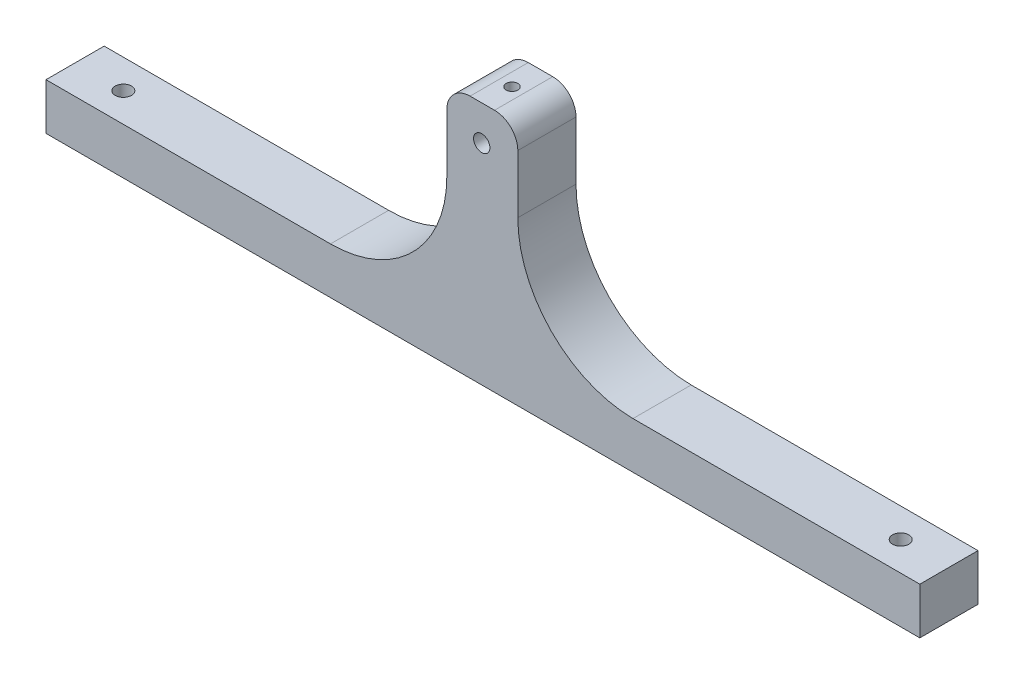
ISO-10303-21;
HEADER;
FILE_DESCRIPTION(('STEP AP214'),'2;1');
FILE_NAME('part.step','',(''),(''),'','','');
FILE_SCHEMA(('AUTOMOTIVE_DESIGN { 1 0 10303 214 1 1 1 1 }'));
ENDSEC;
DATA;
#1=APPLICATION_CONTEXT('core data for automotive mechanical design processes');
#2=APPLICATION_PROTOCOL_DEFINITION('international standard','automotive_design',2000,#1);
#3=PRODUCT_CONTEXT('',#1,'mechanical');
#4=PRODUCT('Part','Part','',(#3));
#5=PRODUCT_RELATED_PRODUCT_CATEGORY('part','',(#4));
#6=PRODUCT_DEFINITION_FORMATION('','',#4);
#7=PRODUCT_DEFINITION_CONTEXT('part definition',#1,'design');
#8=PRODUCT_DEFINITION('design','',#6,#7);
#9=PRODUCT_DEFINITION_SHAPE('','',#8);
#10=(LENGTH_UNIT() NAMED_UNIT(*) SI_UNIT(.MILLI.,.METRE.));
#11=(NAMED_UNIT(*) PLANE_ANGLE_UNIT() SI_UNIT($,.RADIAN.));
#12=(NAMED_UNIT(*) SI_UNIT($,.STERADIAN.) SOLID_ANGLE_UNIT());
#13=UNCERTAINTY_MEASURE_WITH_UNIT(LENGTH_MEASURE(1.E-05),#10,'distance_accuracy_value','');
#14=(GEOMETRIC_REPRESENTATION_CONTEXT(3) GLOBAL_UNCERTAINTY_ASSIGNED_CONTEXT((#13)) GLOBAL_UNIT_ASSIGNED_CONTEXT((#10,
#11,#12)) REPRESENTATION_CONTEXT('',''));
#15=CARTESIAN_POINT('',(0.,0.,0.));
#16=DIRECTION('',(0.,0.,1.));
#17=DIRECTION('',(1.,0.,0.));
#18=AXIS2_PLACEMENT_3D('',#15,#16,#17);
#19=CARTESIAN_POINT('',(0.,4.,0.));
#20=DIRECTION('',(0.,-1.,0.));
#21=DIRECTION('',(0.,0.,-1.));
#22=AXIS2_PLACEMENT_3D('',#19,#20,#21);
#23=CYLINDRICAL_SURFACE('',#22,0.500000000000001);
#24=CARTESIAN_POINT('',(0.,18.695534913197,-0.500000000000001));
#25=CARTESIAN_POINT('',(-0.0237053637619565,18.699008131052,-0.499997494786262));
#26=CARTESIAN_POINT('',(-0.0476111146058155,18.7012660395519,-0.498302834068711));
#27=CARTESIAN_POINT('',(-0.0950644670900677,18.7033398421985,-0.491466676561693));
#28=CARTESIAN_POINT('',(-0.118611338856112,18.7031512906899,-0.486318920976379));
#29=CARTESIAN_POINT('',(-0.1645179646005,18.7005595831414,-0.472762829505504));
#30=CARTESIAN_POINT('',(-0.186881650820679,18.6981643233225,-0.464366181166829));
#31=CARTESIAN_POINT('',(-0.229956831156418,18.6915670708588,-0.44461439062729));
#32=CARTESIAN_POINT('',(-0.250668377227918,18.6873651350564,-0.433259341509148));
#33=CARTESIAN_POINT('',(-0.291077151550338,18.6773953998593,-0.407284075831416));
#34=CARTESIAN_POINT('',(-0.310668649692109,18.6715586236971,-0.39252678322211));
#35=CARTESIAN_POINT('',(-0.347353949116722,18.6590409547665,-0.360471397952351));
#36=CARTESIAN_POINT('',(-0.364445543738273,18.6523593258305,-0.343171087255299));
#37=CARTESIAN_POINT('',(-0.398297140588118,18.6377707032949,-0.303541393532862));
#38=CARTESIAN_POINT('',(-0.414617667843519,18.6298309840516,-0.280847074303816));
#39=CARTESIAN_POINT('',(-0.44334718044683,18.6147346653243,-0.232861325212085));
#40=CARTESIAN_POINT('',(-0.455757434768082,18.6075778122755,-0.207570741436566));
#41=CARTESIAN_POINT('',(-0.474764685533687,18.5960731262698,-0.158688314646173));
#42=CARTESIAN_POINT('',(-0.481945072781722,18.591467997653,-0.135385459309714));
#43=CARTESIAN_POINT('',(-0.492855517396195,18.5843166605364,-0.0876925840878041));
#44=CARTESIAN_POINT('',(-0.496590270570728,18.5817676504972,-0.0633040914281747));
#45=CARTESIAN_POINT('',(-0.500416719502144,18.5791548368849,-0.0140074038601794));
#46=CARTESIAN_POINT('',(-0.500494322941518,18.5791006467716,0.0109024314145192));
#47=CARTESIAN_POINT('',(-0.496964681671987,18.5815129278841,0.0603403554634231));
#48=CARTESIAN_POINT('',(-0.493355553969467,18.583980687193,0.084868242658923));
#49=CARTESIAN_POINT('',(-0.482945040410514,18.5908192985786,0.13155429442335));
#50=CARTESIAN_POINT('',(-0.476321955752921,18.5950829763731,0.153769219564148));
#51=CARTESIAN_POINT('',(-0.460207733552016,18.6049198681586,0.196819059655587));
#52=CARTESIAN_POINT('',(-0.45071545679698,18.6104936021111,0.217653422440926));
#53=CARTESIAN_POINT('',(-0.42751975561694,18.6232088763974,0.260586926005686));
#54=CARTESIAN_POINT('',(-0.413405256844381,18.6304605597961,0.282431308815597));
#55=CARTESIAN_POINT('',(-0.381975508989099,18.6450346881266,0.323678778980057));
#56=CARTESIAN_POINT('',(-0.364657290648408,18.6523571926807,0.34307957330892));
#57=CARTESIAN_POINT('',(-0.324775144776438,18.6671086211179,0.38127716868475));
#58=CARTESIAN_POINT('',(-0.301830085654281,18.6744432810943,0.399717056312423));
#59=CARTESIAN_POINT('',(-0.252663639625408,18.6870982244878,0.432470850704563));
#60=CARTESIAN_POINT('',(-0.226445220194764,18.6924203150206,0.446788456156758));
#61=CARTESIAN_POINT('',(-0.173895535103574,18.6997403479091,0.469581669374129));
#62=CARTESIAN_POINT('',(-0.147775060756627,18.701988498834,0.478458962239705));
#63=CARTESIAN_POINT('',(-0.0943547875079653,18.7034350987376,0.491784894562203));
#64=CARTESIAN_POINT('',(-0.0670563951955149,18.7026370907547,0.4962386714875));
#65=CARTESIAN_POINT('',(-0.0162589601854523,18.6981245696386,0.500291767865877));
#66=CARTESIAN_POINT('',(0.0072337418863273,18.6948366080972,0.500486400627405));
#67=CARTESIAN_POINT('',(0.0535748391224648,18.6859505500852,0.497663045365655));
#68=CARTESIAN_POINT('',(0.0764231998616531,18.6803523304335,0.494644886025338));
#69=CARTESIAN_POINT('',(0.120908540600263,18.6671052535977,0.485691884862844));
#70=CARTESIAN_POINT('',(0.142545387120257,18.6594561709935,0.479756722359383));
#71=CARTESIAN_POINT('',(0.184236672718575,18.6424621130944,0.465343000419542));
#72=CARTESIAN_POINT('',(0.204290435653129,18.63311641873,0.456863361567462));
#73=CARTESIAN_POINT('',(0.250734125870117,18.6088587219121,0.433661831464442));
#74=CARTESIAN_POINT('',(0.276209459457285,18.5932658399514,0.417817300984537));
#75=CARTESIAN_POINT('',(0.323355175675479,18.5604366220727,0.382509048308467));
#76=CARTESIAN_POINT('',(0.345015541275519,18.5431961376542,0.363036066493945));
#77=CARTESIAN_POINT('',(0.384806552172276,18.5078670098701,0.320601251628572));
#78=CARTESIAN_POINT('',(0.402871291009178,18.489768952457,0.297585973666906));
#79=CARTESIAN_POINT('',(0.434945737223519,18.4543625704915,0.248365143560957));
#80=CARTESIAN_POINT('',(0.448964128541109,18.4370526228807,0.222166597527533));
#81=CARTESIAN_POINT('',(0.467258084172318,18.4126243271461,0.178740243924331));
#82=CARTESIAN_POINT('',(0.473080419712234,18.4044227286691,0.162774582957251));
#83=CARTESIAN_POINT('',(0.483206726156964,18.3896248032048,0.129654719727756));
#84=CARTESIAN_POINT('',(0.48751317917127,18.3830258575764,0.112502515947606));
#85=CARTESIAN_POINT('',(0.493763513255056,18.3732149096307,0.0801263059960019));
#86=CARTESIAN_POINT('',(0.495986220325167,18.3696157464893,0.06507747621168));
#87=CARTESIAN_POINT('',(0.49904482511904,18.3646224929786,0.0344876879279488));
#88=CARTESIAN_POINT('',(0.499883196546926,18.3632244695459,0.0189476579380597));
#89=CARTESIAN_POINT('',(0.500094153205712,18.3628748562772,-0.0122170262617462));
#90=CARTESIAN_POINT('',(0.499462481095597,18.3639303720388,-0.027841795192081));
#91=CARTESIAN_POINT('',(0.49678990862585,18.3683097196651,-0.0586520151547212));
#92=CARTESIAN_POINT('',(0.494746637492593,18.3716373674547,-0.0738366822672623));
#93=CARTESIAN_POINT('',(0.48834522568133,18.3817525692947,-0.109375902035238));
#94=CARTESIAN_POINT('',(0.483388487279245,18.3893911613973,-0.129373225102767));
#95=CARTESIAN_POINT('',(0.471440115365611,18.4067833675952,-0.167783893617738));
#96=CARTESIAN_POINT('',(0.464441531460277,18.4165441762625,-0.186191545788228));
#97=CARTESIAN_POINT('',(0.443596606513498,18.4438109421166,-0.23288224037527));
#98=CARTESIAN_POINT('',(0.428236772664244,18.4622702583589,-0.259929894178925));
#99=CARTESIAN_POINT('',(0.393087536700515,18.4997461728596,-0.310531649918295));
#100=CARTESIAN_POINT('',(0.373291875241791,18.518763525275,-0.334080736203742));
#101=CARTESIAN_POINT('',(0.328608062399589,18.5564577761156,-0.378195431318608));
#102=CARTESIAN_POINT('',(0.303583101110706,18.5751066369121,-0.398648246880757));
#103=CARTESIAN_POINT('',(0.248905855416217,18.6099949250355,-0.434871990797156));
#104=CARTESIAN_POINT('',(0.219266133139618,18.6262406665638,-0.450655301620355));
#105=CARTESIAN_POINT('',(0.165950403867537,18.6503446567474,-0.472234458636279));
#106=CARTESIAN_POINT('',(0.143372837393614,18.659227653331,-0.479610255908642));
#107=CARTESIAN_POINT('',(0.0967152573889881,18.6747508934787,-0.491140859762942));
#108=CARTESIAN_POINT('',(0.0726400261782871,18.6813978812318,-0.495305402055565));
#109=CARTESIAN_POINT('',(0.0322390525034773,18.6902325137889,-0.49921644579289));
#110=CARTESIAN_POINT('',(0.0161661232831984,18.6931663155835,-0.500001708456979));
#111=CARTESIAN_POINT('',(0.,18.695534913197,-0.500000000000001));
#112=B_SPLINE_CURVE_WITH_KNOTS('',3,(#24,#25,#26,#27,#28,#29,#30,#31,#32,#33,#34,#35,#36,#37,
#38,#39,#40,#41,#42,#43,#44,#45,#46,#47,#48,#49,#50,#51,#52,#53,#54,#55,#56,#57,#58,#59,#60,#61,
#62,#63,#64,#65,#66,#67,#68,#69,#70,#71,#72,#73,#74,#75,#76,#77,#78,#79,#80,#81,#82,#83,#84,#85,
#86,#87,#88,#89,#90,#91,#92,#93,#94,#95,#96,#97,#98,#99,#100,#101,#102,#103,#104,#105,#106,#107,
#108,#109,#110,#111),.UNSPECIFIED.,.T.,.F.,(4,2,2,2,2,2,2,2,2,2,2,2,2,2,2,2,2,2,2,2,2,2,2,2,2,2,
2,2,2,2,2,2,2,2,2,2,2,2,2,2,2,2,2,4),(0.,0.0718187642896018,0.143768054367204,0.215460885503983,
0.287151461179536,0.362501216871617,0.437917087413059,0.524716622324334,0.611487959712114,
0.685622631926128,0.759656121409143,0.833974865407067,0.908331586604852,0.978768759551509,
1.04923393637221,1.12991816115284,1.21067754344378,1.30120550638534,1.3916519888238,
1.47418089369178,1.55661383707186,1.6274379272656,1.6982657942307,1.76910144941277,
1.83996719702426,1.94085304993524,2.04199997469285,2.14485789073697,2.24749339172806,
2.30398669929448,2.36038706952721,2.4070951638461,2.45371970361633,2.50047943902805,
2.54731789871239,2.61286241634319,2.67863270230085,2.78657208775615,2.89466475523271,
3.00605157492885,3.11714031860139,3.19292341206817,3.26847583710048,3.31745340222926),.UNSPECIFIED.);
#113=CARTESIAN_POINT('',(0.,18.695534913197,-0.500000000000001));
#114=VERTEX_POINT('',#113);
#115=EDGE_CURVE('E45',#114,#114,#112,.T.);
#116=ORIENTED_EDGE('',*,*,#115,.F.);
#117=EDGE_LOOP('',(#116));
#118=FACE_BOUND('',#117,.T.);
#119=CARTESIAN_POINT('',(0.,21.,0.));
#120=DIRECTION('',(0.,1.,0.));
#121=DIRECTION('',(0.,0.,1.));
#122=AXIS2_PLACEMENT_3D('',#119,#120,#121);
#123=CIRCLE('',#122,0.500000000000001);
#124=CARTESIAN_POINT('',(0.,21.,0.500000000000001));
#125=VERTEX_POINT('',#124);
#126=EDGE_CURVE('E182',#125,#125,#123,.T.);
#127=ORIENTED_EDGE('',*,*,#126,.T.);
#128=EDGE_LOOP('',(#127));
#129=FACE_BOUND('',#128,.T.);
#130=ADVANCED_FACE('F41',(#118,#129),#23,.F.);
#131=CARTESIAN_POINT('',(0.,4.,0.));
#132=DIRECTION('',(0.,-1.,0.));
#133=DIRECTION('',(0.,0.,-1.));
#134=AXIS2_PLACEMENT_3D('',#131,#132,#133);
#135=PLANE('',#134);
#136=CARTESIAN_POINT('',(-33.405,4.,0.));
#137=DIRECTION('',(0.,1.,0.));
#138=DIRECTION('',(0.,0.,1.));
#139=AXIS2_PLACEMENT_3D('',#136,#137,#138);
#140=CIRCLE('',#139,0.700000000000001);
#141=CARTESIAN_POINT('',(-33.405,4.,0.700000000000001));
#142=VERTEX_POINT('',#141);
#143=EDGE_CURVE('E217',#142,#142,#140,.T.);
#144=ORIENTED_EDGE('',*,*,#143,.F.);
#145=EDGE_LOOP('',(#144));
#146=FACE_BOUND('',#145,.T.);
#147=DIRECTION('',(1.,0.,0.));
#148=VECTOR('',#147,1.);
#149=CARTESIAN_POINT('',(-37.55,4.,2.5));
#150=LINE('',#149,#148);
#151=CARTESIAN_POINT('',(-37.55,4.,2.5));
#152=VERTEX_POINT('',#151);
#153=CARTESIAN_POINT('',(-13.1019773926338,4.,2.5));
#154=VERTEX_POINT('',#153);
#155=EDGE_CURVE('E231',#152,#154,#150,.T.);
#156=ORIENTED_EDGE('',*,*,#155,.T.);
#157=DIRECTION('',(0.,0.,1.));
#158=VECTOR('',#157,1.);
#159=CARTESIAN_POINT('',(-13.1019773926338,4.,-2.5));
#160=LINE('',#159,#158);
#161=CARTESIAN_POINT('',(-13.1019773926338,4.,-2.5));
#162=VERTEX_POINT('',#161);
#163=EDGE_CURVE('E63',#162,#154,#160,.T.);
#164=ORIENTED_EDGE('',*,*,#163,.F.);
#165=DIRECTION('',(-1.,0.,0.));
#166=VECTOR('',#165,1.);
#167=CARTESIAN_POINT('',(-37.55,4.,-2.5));
#168=LINE('',#167,#166);
#169=CARTESIAN_POINT('',(-37.55,4.,-2.5));
#170=VERTEX_POINT('',#169);
#171=EDGE_CURVE('E225',#162,#170,#168,.T.);
#172=ORIENTED_EDGE('',*,*,#171,.T.);
#173=DIRECTION('',(0.,0.,1.));
#174=VECTOR('',#173,1.);
#175=CARTESIAN_POINT('',(-37.55,4.,2.5));
#176=LINE('',#175,#174);
#177=EDGE_CURVE('E228',#170,#152,#176,.T.);
#178=ORIENTED_EDGE('',*,*,#177,.T.);
#179=EDGE_LOOP('',(#156,#164,#172,#178));
#180=FACE_BOUND('',#179,.T.);
#181=ADVANCED_FACE('F296',(#146,#180),#135,.F.);
#182=CARTESIAN_POINT('',(37.55,4.,-2.5));
#183=VERTEX_POINT('',#182);
#184=CARTESIAN_POINT('',(12.8980226073664,4.,-2.5));
#185=VERTEX_POINT('',#184);
#186=EDGE_CURVE('E71',#183,#185,#168,.T.);
#187=ORIENTED_EDGE('',*,*,#186,.T.);
#188=DIRECTION('',(0.,0.,1.));
#189=VECTOR('',#188,1.);
#190=CARTESIAN_POINT('',(12.8980226073664,4.,-2.5));
#191=LINE('',#190,#189);
#192=CARTESIAN_POINT('',(12.8980226073664,4.,2.5));
#193=VERTEX_POINT('',#192);
#194=EDGE_CURVE('E149',#185,#193,#191,.T.);
#195=ORIENTED_EDGE('',*,*,#194,.T.);
#196=CARTESIAN_POINT('',(37.55,4.,2.5));
#197=VERTEX_POINT('',#196);
#198=EDGE_CURVE('E230',#193,#197,#150,.T.);
#199=ORIENTED_EDGE('',*,*,#198,.T.);
#200=DIRECTION('',(0.,0.,-1.));
#201=VECTOR('',#200,1.);
#202=CARTESIAN_POINT('',(37.55,4.,2.5));
#203=LINE('',#202,#201);
#204=EDGE_CURVE('E223',#197,#183,#203,.T.);
#205=ORIENTED_EDGE('',*,*,#204,.T.);
#206=EDGE_LOOP('',(#187,#195,#199,#205));
#207=FACE_BOUND('',#206,.T.);
#208=CARTESIAN_POINT('',(33.405,4.,0.));
#209=DIRECTION('',(0.,1.,0.));
#210=DIRECTION('',(0.,0.,1.));
#211=AXIS2_PLACEMENT_3D('',#208,#209,#210);
#212=CIRCLE('',#211,0.700000000000001);
#213=CARTESIAN_POINT('',(33.405,4.,0.700000000000001));
#214=VERTEX_POINT('',#213);
#215=EDGE_CURVE('E211',#214,#214,#212,.T.);
#216=ORIENTED_EDGE('',*,*,#215,.F.);
#217=EDGE_LOOP('',(#216));
#218=FACE_BOUND('',#217,.T.);
#219=ADVANCED_FACE('F302',(#207,#218),#135,.F.);
#220=CARTESIAN_POINT('',(0.,0.,0.));
#221=DIRECTION('',(0.,-1.,0.));
#222=DIRECTION('',(0.,0.,-1.));
#223=AXIS2_PLACEMENT_3D('',#220,#221,#222);
#224=PLANE('',#223);
#225=CARTESIAN_POINT('',(33.405,0.,0.));
#226=DIRECTION('',(0.,1.,0.));
#227=DIRECTION('',(0.,0.,1.));
#228=AXIS2_PLACEMENT_3D('',#225,#226,#227);
#229=CIRCLE('',#228,0.700000000000001);
#230=CARTESIAN_POINT('',(33.405,0.,0.700000000000001));
#231=VERTEX_POINT('',#230);
#232=EDGE_CURVE('E210',#231,#231,#229,.T.);
#233=ORIENTED_EDGE('',*,*,#232,.T.);
#234=EDGE_LOOP('',(#233));
#235=FACE_BOUND('',#234,.T.);
#236=DIRECTION('',(0.,0.,-1.));
#237=VECTOR('',#236,1.);
#238=CARTESIAN_POINT('',(37.55,0.,2.5));
#239=LINE('',#238,#237);
#240=CARTESIAN_POINT('',(37.55,0.,2.5));
#241=VERTEX_POINT('',#240);
#242=CARTESIAN_POINT('',(37.55,0.,-2.5));
#243=VERTEX_POINT('',#242);
#244=EDGE_CURVE('E220',#241,#243,#239,.T.);
#245=ORIENTED_EDGE('',*,*,#244,.F.);
#246=DIRECTION('',(1.,0.,0.));
#247=VECTOR('',#246,1.);
#248=CARTESIAN_POINT('',(-37.55,0.,2.5));
#249=LINE('',#248,#247);
#250=CARTESIAN_POINT('',(-37.55,0.,2.5));
#251=VERTEX_POINT('',#250);
#252=EDGE_CURVE('E226',#251,#241,#249,.T.);
#253=ORIENTED_EDGE('',*,*,#252,.F.);
#254=DIRECTION('',(0.,0.,1.));
#255=VECTOR('',#254,1.);
#256=CARTESIAN_POINT('',(-37.55,0.,2.5));
#257=LINE('',#256,#255);
#258=CARTESIAN_POINT('',(-37.55,0.,-2.5));
#259=VERTEX_POINT('',#258);
#260=EDGE_CURVE('E238',#259,#251,#257,.T.);
#261=ORIENTED_EDGE('',*,*,#260,.F.);
#262=DIRECTION('',(-1.,0.,0.));
#263=VECTOR('',#262,1.);
#264=CARTESIAN_POINT('',(-37.55,0.,-2.5));
#265=LINE('',#264,#263);
#266=EDGE_CURVE('E236',#243,#259,#265,.T.);
#267=ORIENTED_EDGE('',*,*,#266,.F.);
#268=EDGE_LOOP('',(#245,#253,#261,#267));
#269=FACE_BOUND('',#268,.T.);
#270=CARTESIAN_POINT('',(-33.405,0.,0.));
#271=DIRECTION('',(0.,1.,0.));
#272=DIRECTION('',(0.,0.,1.));
#273=AXIS2_PLACEMENT_3D('',#270,#271,#272);
#274=CIRCLE('',#273,0.700000000000001);
#275=CARTESIAN_POINT('',(-33.405,0.,0.700000000000001));
#276=VERTEX_POINT('',#275);
#277=EDGE_CURVE('E214',#276,#276,#274,.T.);
#278=ORIENTED_EDGE('',*,*,#277,.T.);
#279=EDGE_LOOP('',(#278));
#280=FACE_BOUND('',#279,.T.);
#281=CARTESIAN_POINT('',(0.,0.,0.));
#282=DIRECTION('',(0.,1.,0.));
#283=DIRECTION('',(0.,0.,1.));
#284=AXIS2_PLACEMENT_3D('',#281,#282,#283);
#285=CIRCLE('',#284,0.500000000000001);
#286=CARTESIAN_POINT('',(0.,0.,0.500000000000001));
#287=VERTEX_POINT('',#286);
#288=EDGE_CURVE('E198',#287,#287,#285,.T.);
#289=ORIENTED_EDGE('',*,*,#288,.T.);
#290=EDGE_LOOP('',(#289));
#291=FACE_BOUND('',#290,.T.);
#292=ADVANCED_FACE('F318',(#235,#269,#280,#291),#224,.T.);
#293=CARTESIAN_POINT('',(37.55,4.,2.5));
#294=DIRECTION('',(-1.,0.,0.));
#295=DIRECTION('',(0.,0.,1.));
#296=AXIS2_PLACEMENT_3D('',#293,#294,#295);
#297=PLANE('',#296);
#298=ORIENTED_EDGE('',*,*,#244,.T.);
#299=DIRECTION('',(0.,-1.,0.));
#300=VECTOR('',#299,1.);
#301=CARTESIAN_POINT('',(37.55,4.,-2.5));
#302=LINE('',#301,#300);
#303=EDGE_CURVE('E11',#183,#243,#302,.T.);
#304=ORIENTED_EDGE('',*,*,#303,.F.);
#305=ORIENTED_EDGE('',*,*,#204,.F.);
#306=DIRECTION('',(0.,-1.,0.));
#307=VECTOR('',#306,1.);
#308=CARTESIAN_POINT('',(37.55,4.,2.5));
#309=LINE('',#308,#307);
#310=EDGE_CURVE('E233',#197,#241,#309,.T.);
#311=ORIENTED_EDGE('',*,*,#310,.T.);
#312=EDGE_LOOP('',(#298,#304,#305,#311));
#313=FACE_BOUND('',#312,.T.);
#314=ADVANCED_FACE('F43',(#313),#297,.F.);
#315=CARTESIAN_POINT('',(-37.55,4.,-2.5));
#316=DIRECTION('',(0.,0.,1.));
#317=DIRECTION('',(1.,0.,0.));
#318=AXIS2_PLACEMENT_3D('',#315,#316,#317);
#319=PLANE('',#318);
#320=CARTESIAN_POINT('',(-0.101977392633719,18.,-2.5));
#321=DIRECTION('',(0.,0.,1.));
#322=DIRECTION('',(1.,0.,0.));
#323=AXIS2_PLACEMENT_3D('',#320,#321,#322);
#324=CIRCLE('',#323,0.702970983813936);
#325=CARTESIAN_POINT('',(0.600993591180217,18.,-2.5));
#326=VERTEX_POINT('',#325);
#327=EDGE_CURVE('E249',#326,#326,#324,.T.);
#328=ORIENTED_EDGE('',*,*,#327,.T.);
#329=EDGE_LOOP('',(#328));
#330=FACE_BOUND('',#329,.T.);
#331=ORIENTED_EDGE('',*,*,#266,.T.);
#332=DIRECTION('',(0.,-1.,0.));
#333=VECTOR('',#332,1.);
#334=CARTESIAN_POINT('',(-37.55,4.,-2.5));
#335=LINE('',#334,#333);
#336=EDGE_CURVE('E55',#170,#259,#335,.T.);
#337=ORIENTED_EDGE('',*,*,#336,.F.);
#338=ORIENTED_EDGE('',*,*,#171,.F.);
#339=CARTESIAN_POINT('',(-13.1019773926337,14.,-2.5));
#340=DIRECTION('',(0.,0.,-1.));
#341=DIRECTION('',(1.,0.,0.));
#342=AXIS2_PLACEMENT_3D('',#339,#340,#341);
#343=CIRCLE('',#342,10.);
#344=CARTESIAN_POINT('',(-3.10197739263372,14.,-2.5));
#345=VERTEX_POINT('',#344);
#346=EDGE_CURVE('E161',#345,#162,#343,.T.);
#347=ORIENTED_EDGE('',*,*,#346,.F.);
#348=DIRECTION('',(0.,-1.,0.));
#349=VECTOR('',#348,1.);
#350=CARTESIAN_POINT('',(-3.10197739263372,14.,-2.5));
#351=LINE('',#350,#349);
#352=CARTESIAN_POINT('',(-3.10197739263372,19.,-2.5));
#353=VERTEX_POINT('',#352);
#354=EDGE_CURVE('E175',#353,#345,#351,.T.);
#355=ORIENTED_EDGE('',*,*,#354,.F.);
#356=CARTESIAN_POINT('',(-1.10197739263372,19.,-2.5));
#357=DIRECTION('',(0.,0.,1.));
#358=DIRECTION('',(-1.,0.,0.));
#359=AXIS2_PLACEMENT_3D('',#356,#357,#358);
#360=CIRCLE('',#359,2.);
#361=CARTESIAN_POINT('',(-1.10197739263372,21.,-2.5));
#362=VERTEX_POINT('',#361);
#363=EDGE_CURVE('E172',#362,#353,#360,.T.);
#364=ORIENTED_EDGE('',*,*,#363,.F.);
#365=DIRECTION('',(-1.,0.,0.));
#366=VECTOR('',#365,1.);
#367=CARTESIAN_POINT('',(-1.10197739263372,21.,-2.5));
#368=LINE('',#367,#366);
#369=CARTESIAN_POINT('',(0.999999999999985,21.,-2.5));
#370=VERTEX_POINT('',#369);
#371=EDGE_CURVE('E169',#370,#362,#368,.T.);
#372=ORIENTED_EDGE('',*,*,#371,.F.);
#373=CARTESIAN_POINT('',(1.,19.,-2.5));
#374=DIRECTION('',(0.,0.,1.));
#375=DIRECTION('',(-1.,0.,0.));
#376=AXIS2_PLACEMENT_3D('',#373,#374,#375);
#377=CIRCLE('',#376,2.);
#378=CARTESIAN_POINT('',(3.,19.,-2.5));
#379=VERTEX_POINT('',#378);
#380=EDGE_CURVE('E158',#379,#370,#377,.T.);
#381=ORIENTED_EDGE('',*,*,#380,.F.);
#382=DIRECTION('',(0.,1.,0.));
#383=VECTOR('',#382,1.);
#384=CARTESIAN_POINT('',(3.,13.9994800170505,-2.5));
#385=LINE('',#384,#383);
#386=CARTESIAN_POINT('',(3.,13.9994800170505,-2.5));
#387=VERTEX_POINT('',#386);
#388=EDGE_CURVE('E141',#387,#379,#385,.T.);
#389=ORIENTED_EDGE('',*,*,#388,.F.);
#390=CARTESIAN_POINT('',(13.,13.9994800170505,-2.5));
#391=DIRECTION('',(0.,0.,-1.));
#392=DIRECTION('',(-1.,0.,0.));
#393=AXIS2_PLACEMENT_3D('',#390,#391,#392);
#394=CIRCLE('',#393,10.);
#395=EDGE_CURVE('E155',#185,#387,#394,.T.);
#396=ORIENTED_EDGE('',*,*,#395,.F.);
#397=ORIENTED_EDGE('',*,*,#186,.F.);
#398=ORIENTED_EDGE('',*,*,#303,.T.);
#399=EDGE_LOOP('',(#331,#337,#338,#347,#355,#364,#372,#381,#389,#396,#397,#398));
#400=FACE_BOUND('',#399,.T.);
#401=ADVANCED_FACE('F154',(#330,#400),#319,.F.);
#402=CARTESIAN_POINT('',(-37.55,4.,2.5));
#403=DIRECTION('',(1.,0.,0.));
#404=DIRECTION('',(0.,0.,-1.));
#405=AXIS2_PLACEMENT_3D('',#402,#403,#404);
#406=PLANE('',#405);
#407=ORIENTED_EDGE('',*,*,#260,.T.);
#408=DIRECTION('',(0.,-1.,0.));
#409=VECTOR('',#408,1.);
#410=CARTESIAN_POINT('',(-37.55,4.,2.5));
#411=LINE('',#410,#409);
#412=EDGE_CURVE('E243',#152,#251,#411,.T.);
#413=ORIENTED_EDGE('',*,*,#412,.F.);
#414=ORIENTED_EDGE('',*,*,#177,.F.);
#415=ORIENTED_EDGE('',*,*,#336,.T.);
#416=EDGE_LOOP('',(#407,#413,#414,#415));
#417=FACE_BOUND('',#416,.T.);
#418=ADVANCED_FACE('F344',(#417),#406,.F.);
#419=CARTESIAN_POINT('',(-37.55,4.,2.5));
#420=DIRECTION('',(0.,0.,-1.));
#421=DIRECTION('',(-1.,0.,0.));
#422=AXIS2_PLACEMENT_3D('',#419,#420,#421);
#423=PLANE('',#422);
#424=CARTESIAN_POINT('',(-0.101977392633719,18.,2.5));
#425=DIRECTION('',(0.,0.,1.));
#426=DIRECTION('',(1.,0.,0.));
#427=AXIS2_PLACEMENT_3D('',#424,#425,#426);
#428=CIRCLE('',#427,0.702970983813936);
#429=CARTESIAN_POINT('',(0.600993591180217,18.,2.5));
#430=VERTEX_POINT('',#429);
#431=EDGE_CURVE('E255',#430,#430,#428,.T.);
#432=ORIENTED_EDGE('',*,*,#431,.F.);
#433=EDGE_LOOP('',(#432));
#434=FACE_BOUND('',#433,.T.);
#435=ORIENTED_EDGE('',*,*,#252,.T.);
#436=ORIENTED_EDGE('',*,*,#310,.F.);
#437=ORIENTED_EDGE('',*,*,#198,.F.);
#438=CARTESIAN_POINT('',(13.,13.9994800170505,2.5));
#439=DIRECTION('',(0.,0.,-1.));
#440=DIRECTION('',(-1.,0.,0.));
#441=AXIS2_PLACEMENT_3D('',#438,#439,#440);
#442=CIRCLE('',#441,10.);
#443=CARTESIAN_POINT('',(3.,13.9994800170505,2.5));
#444=VERTEX_POINT('',#443);
#445=EDGE_CURVE('E181',#193,#444,#442,.T.);
#446=ORIENTED_EDGE('',*,*,#445,.T.);
#447=DIRECTION('',(0.,1.,0.));
#448=VECTOR('',#447,1.);
#449=CARTESIAN_POINT('',(3.,13.9994800170505,2.5));
#450=LINE('',#449,#448);
#451=CARTESIAN_POINT('',(3.,19.,2.5));
#452=VERTEX_POINT('',#451);
#453=EDGE_CURVE('E143',#444,#452,#450,.T.);
#454=ORIENTED_EDGE('',*,*,#453,.T.);
#455=CARTESIAN_POINT('',(1.,19.,2.5));
#456=DIRECTION('',(0.,0.,1.));
#457=DIRECTION('',(-1.,0.,0.));
#458=AXIS2_PLACEMENT_3D('',#455,#456,#457);
#459=CIRCLE('',#458,2.);
#460=CARTESIAN_POINT('',(0.999999999999985,21.,2.5));
#461=VERTEX_POINT('',#460);
#462=EDGE_CURVE('E185',#452,#461,#459,.T.);
#463=ORIENTED_EDGE('',*,*,#462,.T.);
#464=DIRECTION('',(-1.,0.,0.));
#465=VECTOR('',#464,1.);
#466=CARTESIAN_POINT('',(-1.10197739263372,21.,2.5));
#467=LINE('',#466,#465);
#468=CARTESIAN_POINT('',(-1.10197739263372,21.,2.5));
#469=VERTEX_POINT('',#468);
#470=EDGE_CURVE('E188',#461,#469,#467,.T.);
#471=ORIENTED_EDGE('',*,*,#470,.T.);
#472=CARTESIAN_POINT('',(-1.10197739263372,19.,2.5));
#473=DIRECTION('',(0.,0.,1.));
#474=DIRECTION('',(-1.,0.,0.));
#475=AXIS2_PLACEMENT_3D('',#472,#473,#474);
#476=CIRCLE('',#475,2.);
#477=CARTESIAN_POINT('',(-3.10197739263372,19.,2.5));
#478=VERTEX_POINT('',#477);
#479=EDGE_CURVE('E191',#469,#478,#476,.T.);
#480=ORIENTED_EDGE('',*,*,#479,.T.);
#481=DIRECTION('',(0.,-1.,0.));
#482=VECTOR('',#481,1.);
#483=CARTESIAN_POINT('',(-3.10197739263372,14.,2.5));
#484=LINE('',#483,#482);
#485=CARTESIAN_POINT('',(-3.10197739263372,14.,2.5));
#486=VERTEX_POINT('',#485);
#487=EDGE_CURVE('E164',#478,#486,#484,.T.);
#488=ORIENTED_EDGE('',*,*,#487,.T.);
#489=CARTESIAN_POINT('',(-13.1019773926337,14.,2.5));
#490=DIRECTION('',(0.,0.,-1.));
#491=DIRECTION('',(1.,0.,0.));
#492=AXIS2_PLACEMENT_3D('',#489,#490,#491);
#493=CIRCLE('',#492,10.);
#494=EDGE_CURVE('E178',#486,#154,#493,.T.);
#495=ORIENTED_EDGE('',*,*,#494,.T.);
#496=ORIENTED_EDGE('',*,*,#155,.F.);
#497=ORIENTED_EDGE('',*,*,#412,.T.);
#498=EDGE_LOOP('',(#435,#436,#437,#446,#454,#463,#471,#480,#488,#495,#496,#497));
#499=FACE_BOUND('',#498,.T.);
#500=ADVANCED_FACE('F314',(#434,#499),#423,.F.);
#501=CARTESIAN_POINT('',(-33.405,4.,0.));
#502=DIRECTION('',(0.,-1.,0.));
#503=DIRECTION('',(0.,0.,-1.));
#504=AXIS2_PLACEMENT_3D('',#501,#502,#503);
#505=CYLINDRICAL_SURFACE('',#504,0.700000000000001);
#506=ORIENTED_EDGE('',*,*,#143,.T.);
#507=EDGE_LOOP('',(#506));
#508=FACE_BOUND('',#507,.T.);
#509=ORIENTED_EDGE('',*,*,#277,.F.);
#510=EDGE_LOOP('',(#509));
#511=FACE_BOUND('',#510,.T.);
#512=ADVANCED_FACE('F323',(#508,#511),#505,.F.);
#513=CARTESIAN_POINT('',(33.405,4.,0.));
#514=DIRECTION('',(0.,-1.,0.));
#515=DIRECTION('',(0.,0.,-1.));
#516=AXIS2_PLACEMENT_3D('',#513,#514,#515);
#517=CYLINDRICAL_SURFACE('',#516,0.700000000000001);
#518=ORIENTED_EDGE('',*,*,#215,.T.);
#519=EDGE_LOOP('',(#518));
#520=FACE_BOUND('',#519,.T.);
#521=ORIENTED_EDGE('',*,*,#232,.F.);
#522=EDGE_LOOP('',(#521));
#523=FACE_BOUND('',#522,.T.);
#524=ADVANCED_FACE('F292',(#520,#523),#517,.F.);
#525=CARTESIAN_POINT('',(0.,17.304465086803,-0.500000000000001));
#526=CARTESIAN_POINT('',(0.0258618141356931,17.308258634627,-0.49999828742849));
#527=CARTESIAN_POINT('',(0.0515498434452829,17.3135129854516,-0.497977538203927));
#528=CARTESIAN_POINT('',(0.101682554920011,17.3266744706638,-0.490212652635475));
#529=CARTESIAN_POINT('',(0.126123514345496,17.3345890672012,-0.484457999742146));
#530=CARTESIAN_POINT('',(0.172942585505726,17.3525351408064,-0.469774417343189));
#531=CARTESIAN_POINT('',(0.195335691135679,17.3625491019925,-0.460871358520716));
#532=CARTESIAN_POINT('',(0.237962275849497,17.3842223688213,-0.440379368019352));
#533=CARTESIAN_POINT('',(0.25819570740685,17.3958817106599,-0.428790377250733));
#534=CARTESIAN_POINT('',(0.30415458146345,17.4253334621036,-0.398161615480575));
#535=CARTESIAN_POINT('',(0.328773985959798,17.4436938360846,-0.378007217478384));
#536=CARTESIAN_POINT('',(0.373503938624557,17.4814037990323,-0.33389567925417));
#537=CARTESIAN_POINT('',(0.393604601899077,17.5007554451323,-0.309930394265784));
#538=CARTESIAN_POINT('',(0.425475726581897,17.5348268253667,-0.263786123783452));
#539=CARTESIAN_POINT('',(0.438109127761152,17.5496670697755,-0.242286001090465));
#540=CARTESIAN_POINT('',(0.46032814946897,17.5777479308974,-0.1968158822523));
#541=CARTESIAN_POINT('',(0.469922983564754,17.5909933063842,-0.1728536501889));
#542=CARTESIAN_POINT('',(0.482351007962863,17.609108079076,-0.132589125257688));
#543=CARTESIAN_POINT('',(0.486341607445802,17.615180672119,-0.117195448292172));
#544=CARTESIAN_POINT('',(0.492900877961477,17.625400447164,-0.0854968254579561));
#545=CARTESIAN_POINT('',(0.495472509348005,17.6295516348007,-0.0691938555168308));
#546=CARTESIAN_POINT('',(0.499007330180203,17.6353107620313,-0.035734026402415));
#547=CARTESIAN_POINT('',(0.499950118738417,17.6368864308604,-0.0185690694254835));
#548=CARTESIAN_POINT('',(0.500045983949038,17.6370453383762,0.0157771871433453));
#549=CARTESIAN_POINT('',(0.499199342023019,17.6356290476047,0.0329584837407647));
#550=CARTESIAN_POINT('',(0.495712473881824,17.6299381096107,0.0677979437161613));
#551=CARTESIAN_POINT('',(0.492957907061919,17.6254815329673,0.0854131083879408));
#552=CARTESIAN_POINT('',(0.485803079117135,17.6143499201811,0.119591626659943));
#553=CARTESIAN_POINT('',(0.481397516608767,17.6076677453664,0.136151388728569));
#554=CARTESIAN_POINT('',(0.467912684610217,17.5881661384906,0.178375311417345));
#555=CARTESIAN_POINT('',(0.457645753396098,17.5741533541732,0.203096072288974));
#556=CARTESIAN_POINT('',(0.43387210293269,17.5445904264197,0.249889483039944));
#557=CARTESIAN_POINT('',(0.420359117189245,17.529037344002,0.271956885439488));
#558=CARTESIAN_POINT('',(0.389090154343799,17.4964433811881,0.315236070377002));
#559=CARTESIAN_POINT('',(0.371089282813672,17.4793794551332,0.336254442738749));
#560=CARTESIAN_POINT('',(0.331533863027201,17.4460093262199,0.375307724832531));
#561=CARTESIAN_POINT('',(0.309983329698063,17.4297022936686,0.393345959668213));
#562=CARTESIAN_POINT('',(0.265816377882269,17.4003983561223,0.424250481114124));
#563=CARTESIAN_POINT('',(0.243555568639319,17.387233816154,0.437462432145865));
#564=CARTESIAN_POINT('',(0.196359297271709,17.3629243165571,0.460577051882813));
#565=CARTESIAN_POINT('',(0.171426591668729,17.3517773068321,0.470483088603844));
#566=CARTESIAN_POINT('',(0.123400834037807,17.3337235595504,0.485076939681741));
#567=CARTESIAN_POINT('',(0.100630637755018,17.3264262217194,0.49033882144264));
#568=CARTESIAN_POINT('',(0.0539769415734217,17.3141232096064,0.497637138712527));
#569=CARTESIAN_POINT('',(0.0300941511372601,17.3091160963837,0.499675601469239));
#570=CARTESIAN_POINT('',(-0.018197512342141,17.3016103579417,0.500253633549233));
#571=CARTESIAN_POINT('',(-0.0426079284216189,17.2991205334956,0.498780987399715));
#572=CARTESIAN_POINT('',(-0.0910725841433456,17.2966948835055,0.492243492912033));
#573=CARTESIAN_POINT('',(-0.11512679688075,17.2967592499109,0.487178374624929));
#574=CARTESIAN_POINT('',(-0.160803241402104,17.2991417617101,0.474000261269286));
#575=CARTESIAN_POINT('',(-0.182486341788624,17.3013344980001,0.466072226565663));
#576=CARTESIAN_POINT('',(-0.224350769244885,17.3074388567605,0.447428493321113));
#577=CARTESIAN_POINT('',(-0.244531839073681,17.3113507728729,0.436712318683784));
#578=CARTESIAN_POINT('',(-0.284616641752119,17.320831796453,0.411818980761147));
#579=CARTESIAN_POINT('',(-0.304362420177879,17.326510352467,0.397430302538016));
#580=CARTESIAN_POINT('',(-0.341406880647967,17.3387714183102,0.366102284595752));
#581=CARTESIAN_POINT('',(-0.358703368247352,17.3453547284802,0.34916068528131));
#582=CARTESIAN_POINT('',(-0.393020242589559,17.3597982879992,0.310327448086671));
#583=CARTESIAN_POINT('',(-0.409614657640943,17.3677025400121,0.288074390422188));
#584=CARTESIAN_POINT('',(-0.43898250721337,17.3828539755623,0.240965165878072));
#585=CARTESIAN_POINT('',(-0.451756656533111,17.3901012818416,0.216109487143758));
#586=CARTESIAN_POINT('',(-0.471682758997498,17.402000867892,0.167652857877908));
#587=CARTESIAN_POINT('',(-0.47935470786059,17.406869548083,0.144320414768024));
#588=CARTESIAN_POINT('',(-0.491220581873753,17.4145865121407,0.0964774486403153));
#589=CARTESIAN_POINT('',(-0.495419243099562,17.4174375464422,0.0719685782053316));
#590=CARTESIAN_POINT('',(-0.500125934755896,17.4206427172309,0.0223171882536562));
#591=CARTESIAN_POINT('',(-0.500617627814981,17.4209858004604,-0.00282764676766823));
#592=CARTESIAN_POINT('',(-0.497833271715362,17.4190793994715,-0.0528122810706571));
#593=CARTESIAN_POINT('',(-0.494555692137026,17.416828862177,-0.0776519523081707));
#594=CARTESIAN_POINT('',(-0.484756411782683,17.4103565058337,-0.124709520235514));
#595=CARTESIAN_POINT('',(-0.478455175012719,17.4062697064328,-0.146993555591946));
#596=CARTESIAN_POINT('',(-0.462972287373361,17.3967311843637,-0.19022200385344));
#597=CARTESIAN_POINT('',(-0.453789456716392,17.3912789028222,-0.211165863825424));
#598=CARTESIAN_POINT('',(-0.4313238485152,17.3788030029601,-0.25422029364319));
#599=CARTESIAN_POINT('',(-0.417650520116622,17.37166638915,-0.276094084741675));
#600=CARTESIAN_POINT('',(-0.387135701580713,17.3572417957743,-0.317470687154578));
#601=CARTESIAN_POINT('',(-0.370291492324901,17.3499536911084,-0.336971439715812));
#602=CARTESIAN_POINT('',(-0.331292851836853,17.3351151533595,-0.375622674386965));
#603=CARTESIAN_POINT('',(-0.30873360473645,17.3276523323121,-0.39440289072117));
#604=CARTESIAN_POINT('',(-0.26028091109132,17.3146274419589,-0.427924588016558));
#605=CARTESIAN_POINT('',(-0.234388667724853,17.3090646893818,-0.442667520419817));
#606=CARTESIAN_POINT('',(-0.182115320068449,17.3011510907589,-0.466469316050568));
#607=CARTESIAN_POINT('',(-0.155928800762845,17.2985841171566,-0.475881035631492));
#608=CARTESIAN_POINT('',(-0.102280041147529,17.2965211004203,-0.490208102586419));
#609=CARTESIAN_POINT('',(-0.0748222592420036,17.2970150284688,-0.495138073257302));
#610=CARTESIAN_POINT('',(-0.0394341581643604,17.2997713015446,-0.4985063690191));
#611=CARTESIAN_POINT('',(-0.0315362602419646,17.3005220686415,-0.499067080365618));
#612=CARTESIAN_POINT('',(-0.0157535466243549,17.3022918661192,-0.499814130886709));
#613=CARTESIAN_POINT('',(-0.00786872929304664,17.3033108599289,-0.500000521067918));
#614=CARTESIAN_POINT('',(0.,17.304465086803,-0.500000000000001));
#615=B_SPLINE_CURVE_WITH_KNOTS('',3,(#525,#526,#527,#528,#529,#530,#531,#532,#533,#534,#535,
#536,#537,#538,#539,#540,#541,#542,#543,#544,#545,#546,#547,#548,#549,#550,#551,#552,#553,#554,
#555,#556,#557,#558,#559,#560,#561,#562,#563,#564,#565,#566,#567,#568,#569,#570,#571,#572,#573,
#574,#575,#576,#577,#578,#579,#580,#581,#582,#583,#584,#585,#586,#587,#588,#589,#590,#591,#592,
#593,#594,#595,#596,#597,#598,#599,#600,#601,#602,#603,#604,#605,#606,#607,#608,#609,#610,#611,
#612,#613,#614),.UNSPECIFIED.,.T.,.F.,(4,2,2,2,2,2,2,2,2,2,2,2,2,2,2,2,2,2,2,2,2,2,2,2,2,2,2,2,
2,2,2,2,2,2,2,2,2,2,2,2,2,2,2,2,4),(0.,0.0783797510836575,0.156981222853933,0.23495127993955,
0.312923052506782,0.422555616801821,0.532425721425325,0.619261407245798,0.705831210625295,
0.756755284612714,0.807572711494569,0.859022121829374,0.910463441379545,0.965289245429942,
1.02029262615511,1.11044048415731,1.20076379092625,1.29797142266383,1.39506985109977,
1.48186751477758,1.56857647841066,1.64171398508145,1.71480547635779,1.78815163055458,
1.86150329678149,1.9307798542708,2.00006824903931,2.07502892198812,2.15005633676832,
2.23627434423023,2.32247620958659,2.39728245147426,2.4719865207836,2.54701963490143,
2.62208322511287,2.69235472736569,2.76265503792905,2.84264046814722,2.92269480314897,
3.01308460651443,3.10344187109435,3.18677274138801,3.26983072892825,3.29368184386445,
3.31752970852304),.UNSPECIFIED.);
#616=CARTESIAN_POINT('',(0.,17.304465086803,-0.500000000000001));
#617=VERTEX_POINT('',#616);
#618=EDGE_CURVE('E250',#617,#617,#615,.T.);
#619=ORIENTED_EDGE('',*,*,#618,.F.);
#620=EDGE_LOOP('',(#619));
#621=FACE_BOUND('',#620,.T.);
#622=ORIENTED_EDGE('',*,*,#288,.F.);
#623=EDGE_LOOP('',(#622));
#624=FACE_BOUND('',#623,.T.);
#625=ADVANCED_FACE('F256',(#621,#624),#23,.F.);
#626=CARTESIAN_POINT('',(-13.1019773926337,14.,-2.5));
#627=DIRECTION('',(0.,0.,1.));
#628=DIRECTION('',(1.,0.,0.));
#629=AXIS2_PLACEMENT_3D('',#626,#627,#628);
#630=CYLINDRICAL_SURFACE('',#629,10.);
#631=ORIENTED_EDGE('',*,*,#494,.F.);
#632=DIRECTION('',(0.,0.,1.));
#633=VECTOR('',#632,1.);
#634=CARTESIAN_POINT('',(-3.10197739263372,14.,-2.5));
#635=LINE('',#634,#633);
#636=EDGE_CURVE('E196',#345,#486,#635,.T.);
#637=ORIENTED_EDGE('',*,*,#636,.F.);
#638=ORIENTED_EDGE('',*,*,#346,.T.);
#639=ORIENTED_EDGE('',*,*,#163,.T.);
#640=EDGE_LOOP('',(#631,#637,#638,#639));
#641=FACE_BOUND('',#640,.T.);
#642=ADVANCED_FACE('F270',(#641),#630,.F.);
#643=CARTESIAN_POINT('',(-3.10197739263372,14.,-2.5));
#644=DIRECTION('',(-1.,0.,0.));
#645=DIRECTION('',(0.,-1.,0.));
#646=AXIS2_PLACEMENT_3D('',#643,#644,#645);
#647=PLANE('',#646);
#648=ORIENTED_EDGE('',*,*,#487,.F.);
#649=DIRECTION('',(0.,0.,1.));
#650=VECTOR('',#649,1.);
#651=CARTESIAN_POINT('',(-3.10197739263372,19.,-2.5));
#652=LINE('',#651,#650);
#653=EDGE_CURVE('E199',#353,#478,#652,.T.);
#654=ORIENTED_EDGE('',*,*,#653,.F.);
#655=ORIENTED_EDGE('',*,*,#354,.T.);
#656=ORIENTED_EDGE('',*,*,#636,.T.);
#657=EDGE_LOOP('',(#648,#654,#655,#656));
#658=FACE_BOUND('',#657,.T.);
#659=ADVANCED_FACE('F265',(#658),#647,.T.);
#660=CARTESIAN_POINT('',(-1.10197739263372,19.,-2.5));
#661=DIRECTION('',(0.,0.,1.));
#662=DIRECTION('',(1.,0.,0.));
#663=AXIS2_PLACEMENT_3D('',#660,#661,#662);
#664=CYLINDRICAL_SURFACE('',#663,2.);
#665=ORIENTED_EDGE('',*,*,#479,.F.);
#666=DIRECTION('',(0.,0.,1.));
#667=VECTOR('',#666,1.);
#668=CARTESIAN_POINT('',(-1.10197739263372,21.,-2.5));
#669=LINE('',#668,#667);
#670=EDGE_CURVE('E201',#362,#469,#669,.T.);
#671=ORIENTED_EDGE('',*,*,#670,.F.);
#672=ORIENTED_EDGE('',*,*,#363,.T.);
#673=ORIENTED_EDGE('',*,*,#653,.T.);
#674=EDGE_LOOP('',(#665,#671,#672,#673));
#675=FACE_BOUND('',#674,.T.);
#676=ADVANCED_FACE('F269',(#675),#664,.T.);
#677=CARTESIAN_POINT('',(-1.10197739263372,21.,-2.5));
#678=DIRECTION('',(0.,1.,0.));
#679=DIRECTION('',(0.,0.,1.));
#680=AXIS2_PLACEMENT_3D('',#677,#678,#679);
#681=PLANE('',#680);
#682=ORIENTED_EDGE('',*,*,#126,.F.);
#683=EDGE_LOOP('',(#682));
#684=FACE_BOUND('',#683,.T.);
#685=ORIENTED_EDGE('',*,*,#470,.F.);
#686=DIRECTION('',(0.,0.,1.));
#687=VECTOR('',#686,1.);
#688=CARTESIAN_POINT('',(0.999999999999985,21.,-2.5));
#689=LINE('',#688,#687);
#690=EDGE_CURVE('E203',#370,#461,#689,.T.);
#691=ORIENTED_EDGE('',*,*,#690,.F.);
#692=ORIENTED_EDGE('',*,*,#371,.T.);
#693=ORIENTED_EDGE('',*,*,#670,.T.);
#694=EDGE_LOOP('',(#685,#691,#692,#693));
#695=FACE_BOUND('',#694,.T.);
#696=ADVANCED_FACE('F274',(#684,#695),#681,.T.);
#697=CARTESIAN_POINT('',(1.,19.,-2.5));
#698=DIRECTION('',(0.,0.,1.));
#699=DIRECTION('',(1.,0.,0.));
#700=AXIS2_PLACEMENT_3D('',#697,#698,#699);
#701=CYLINDRICAL_SURFACE('',#700,2.);
#702=ORIENTED_EDGE('',*,*,#462,.F.);
#703=DIRECTION('',(0.,0.,1.));
#704=VECTOR('',#703,1.);
#705=CARTESIAN_POINT('',(3.,19.,-2.5));
#706=LINE('',#705,#704);
#707=EDGE_CURVE('E148',#379,#452,#706,.T.);
#708=ORIENTED_EDGE('',*,*,#707,.F.);
#709=ORIENTED_EDGE('',*,*,#380,.T.);
#710=ORIENTED_EDGE('',*,*,#690,.T.);
#711=EDGE_LOOP('',(#702,#708,#709,#710));
#712=FACE_BOUND('',#711,.T.);
#713=ADVANCED_FACE('F278',(#712),#701,.T.);
#714=CARTESIAN_POINT('',(3.,13.9994800170505,-2.5));
#715=DIRECTION('',(1.,0.,0.));
#716=DIRECTION('',(0.,1.,0.));
#717=AXIS2_PLACEMENT_3D('',#714,#715,#716);
#718=PLANE('',#717);
#719=ORIENTED_EDGE('',*,*,#453,.F.);
#720=DIRECTION('',(0.,0.,1.));
#721=VECTOR('',#720,1.);
#722=CARTESIAN_POINT('',(3.,13.9994800170505,-2.5));
#723=LINE('',#722,#721);
#724=EDGE_CURVE('E138',#387,#444,#723,.T.);
#725=ORIENTED_EDGE('',*,*,#724,.F.);
#726=ORIENTED_EDGE('',*,*,#388,.T.);
#727=ORIENTED_EDGE('',*,*,#707,.T.);
#728=EDGE_LOOP('',(#719,#725,#726,#727));
#729=FACE_BOUND('',#728,.T.);
#730=ADVANCED_FACE('F140',(#729),#718,.T.);
#731=CARTESIAN_POINT('',(13.,13.9994800170505,-2.5));
#732=DIRECTION('',(0.,0.,1.));
#733=DIRECTION('',(1.,0.,0.));
#734=AXIS2_PLACEMENT_3D('',#731,#732,#733);
#735=CYLINDRICAL_SURFACE('',#734,10.);
#736=ORIENTED_EDGE('',*,*,#445,.F.);
#737=ORIENTED_EDGE('',*,*,#194,.F.);
#738=ORIENTED_EDGE('',*,*,#395,.T.);
#739=ORIENTED_EDGE('',*,*,#724,.T.);
#740=EDGE_LOOP('',(#736,#737,#738,#739));
#741=FACE_BOUND('',#740,.T.);
#742=ADVANCED_FACE('F160',(#741),#735,.F.);
#743=CARTESIAN_POINT('',(-0.101977392633719,18.,-7.49999999999999));
#744=DIRECTION('',(0.,0.,1.));
#745=DIRECTION('',(1.,0.,0.));
#746=AXIS2_PLACEMENT_3D('',#743,#744,#745);
#747=CYLINDRICAL_SURFACE('',#746,0.702970983813936);
#748=ORIENTED_EDGE('',*,*,#431,.T.);
#749=EDGE_LOOP('',(#748));
#750=FACE_BOUND('',#749,.T.);
#751=ORIENTED_EDGE('',*,*,#618,.T.);
#752=EDGE_LOOP('',(#751));
#753=FACE_BOUND('',#752,.T.);
#754=ORIENTED_EDGE('',*,*,#115,.T.);
#755=EDGE_LOOP('',(#754));
#756=FACE_BOUND('',#755,.T.);
#757=ORIENTED_EDGE('',*,*,#327,.F.);
#758=EDGE_LOOP('',(#757));
#759=FACE_BOUND('',#758,.T.);
#760=ADVANCED_FACE('F260',(#750,#753,#756,#759),#747,.F.);
#761=CLOSED_SHELL('',(#130,#181,#219,#292,#314,#401,#418,#500,#512,#524,#625,#642,#659,#676,
#696,#713,#730,#742,#760));
#762=MANIFOLD_SOLID_BREP('B2',#761);
#763=ADVANCED_BREP_SHAPE_REPRESENTATION('',(#18,#762),#14);
#764=SHAPE_DEFINITION_REPRESENTATION(#9,#763);
ENDSEC;
END-ISO-10303-21;
